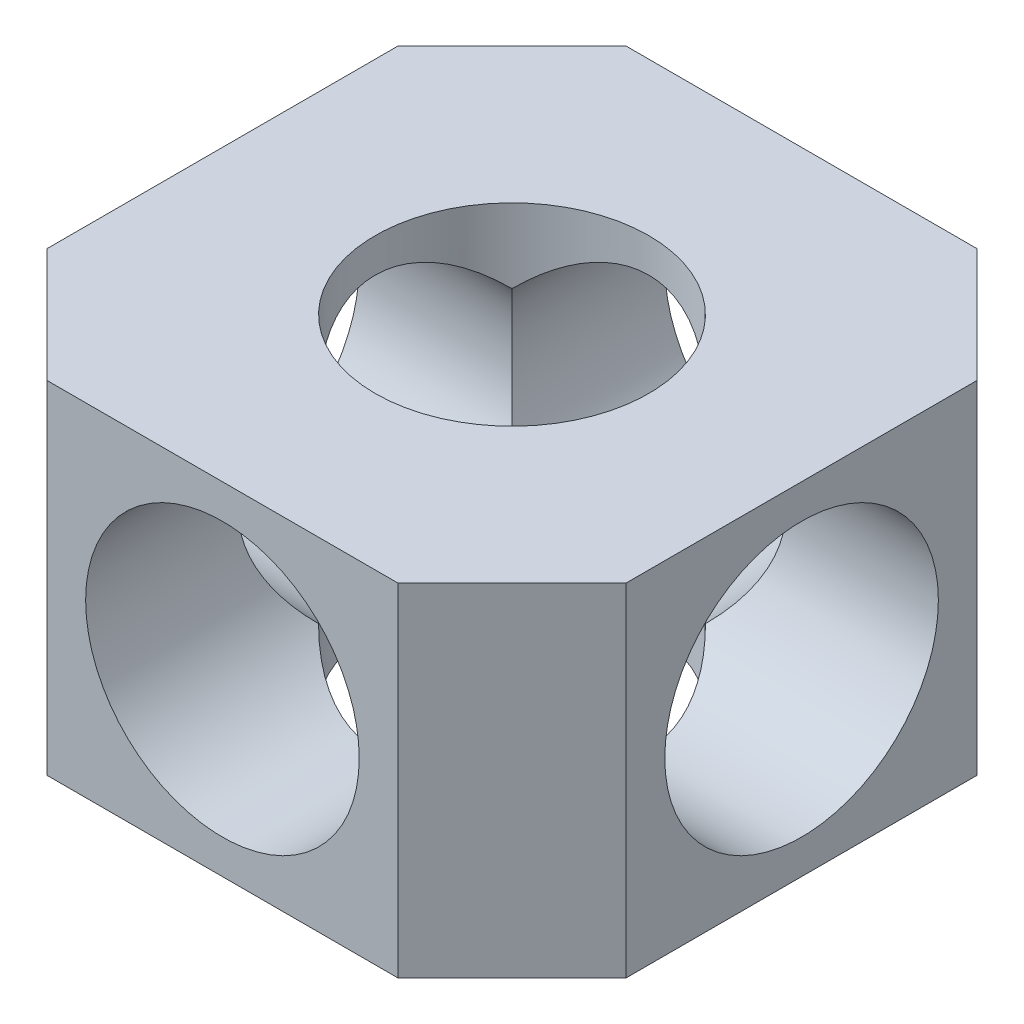
ISO-10303-21;
HEADER;
FILE_DESCRIPTION(('STEP AP214'),'2;1');
FILE_NAME('part.step','',(''),(''),'','','');
FILE_SCHEMA(('AUTOMOTIVE_DESIGN { 1 0 10303 214 1 1 1 1 }'));
ENDSEC;
DATA;
#1=APPLICATION_CONTEXT('core data for automotive mechanical design processes');
#2=APPLICATION_PROTOCOL_DEFINITION('international standard','automotive_design',2000,#1);
#3=PRODUCT_CONTEXT('',#1,'mechanical');
#4=PRODUCT('Part','Part','',(#3));
#5=PRODUCT_RELATED_PRODUCT_CATEGORY('part','',(#4));
#6=PRODUCT_DEFINITION_FORMATION('','',#4);
#7=PRODUCT_DEFINITION_CONTEXT('part definition',#1,'design');
#8=PRODUCT_DEFINITION('design','',#6,#7);
#9=PRODUCT_DEFINITION_SHAPE('','',#8);
#10=(LENGTH_UNIT() NAMED_UNIT(*) SI_UNIT(.MILLI.,.METRE.));
#11=(NAMED_UNIT(*) PLANE_ANGLE_UNIT() SI_UNIT($,.RADIAN.));
#12=(NAMED_UNIT(*) SI_UNIT($,.STERADIAN.) SOLID_ANGLE_UNIT());
#13=UNCERTAINTY_MEASURE_WITH_UNIT(LENGTH_MEASURE(1.E-05),#10,'distance_accuracy_value','');
#14=(GEOMETRIC_REPRESENTATION_CONTEXT(3) GLOBAL_UNCERTAINTY_ASSIGNED_CONTEXT((#13)) GLOBAL_UNIT_ASSIGNED_CONTEXT((#10,
#11,#12)) REPRESENTATION_CONTEXT('',''));
#15=CARTESIAN_POINT('',(0.,0.,0.));
#16=DIRECTION('',(0.,0.,1.));
#17=DIRECTION('',(1.,0.,0.));
#18=AXIS2_PLACEMENT_3D('',#15,#16,#17);
#19=CARTESIAN_POINT('',(0.,7.5,0.));
#20=DIRECTION('',(0.,1.,0.));
#21=DIRECTION('',(0.,0.,1.));
#22=AXIS2_PLACEMENT_3D('',#19,#20,#21);
#23=CYLINDRICAL_SURFACE('',#22,6.00000000000001);
#24=CARTESIAN_POINT('',(0.,7.5,0.));
#25=DIRECTION('',(0.,1.,0.));
#26=DIRECTION('',(0.,0.,1.));
#27=AXIS2_PLACEMENT_3D('',#24,#25,#26);
#28=CIRCLE('',#27,6.00000000000001);
#29=CARTESIAN_POINT('',(0.,7.5,6.00000000000001));
#30=VERTEX_POINT('',#29);
#31=EDGE_CURVE('E228',#30,#30,#28,.T.);
#32=ORIENTED_EDGE('',*,*,#31,.T.);
#33=EDGE_LOOP('',(#32));
#34=FACE_BOUND('',#33,.T.);
#35=CARTESIAN_POINT('',(0.,0.,0.));
#36=DIRECTION('',(0.,0.707106781186547,-0.707106781186547));
#37=DIRECTION('',(0.,0.707106781186547,0.707106781186547));
#38=AXIS2_PLACEMENT_3D('',#35,#36,#37);
#39=ELLIPSE('',#38,8.48528137423859,6.00000000000001);
#40=CARTESIAN_POINT('',(4.24264068711929,4.24264068711929,4.24264068711929));
#41=VERTEX_POINT('',#40);
#42=CARTESIAN_POINT('',(-4.24264068711929,4.24264068711929,4.24264068711929));
#43=VERTEX_POINT('',#42);
#44=EDGE_CURVE('E158',#41,#43,#39,.F.);
#45=ORIENTED_EDGE('',*,*,#44,.T.);
#46=CARTESIAN_POINT('',(0.,0.,0.));
#47=DIRECTION('',(0.707106781186547,0.707106781186547,0.));
#48=DIRECTION('',(-0.707106781186547,0.707106781186547,0.));
#49=AXIS2_PLACEMENT_3D('',#46,#47,#48);
#50=ELLIPSE('',#49,8.48528137423859,6.00000000000001);
#51=CARTESIAN_POINT('',(-4.24264068711929,4.24264068711929,-4.24264068711929));
#52=VERTEX_POINT('',#51);
#53=EDGE_CURVE('E151',#43,#52,#50,.F.);
#54=ORIENTED_EDGE('',*,*,#53,.T.);
#55=CARTESIAN_POINT('',(0.,0.,0.));
#56=DIRECTION('',(0.,0.707106781186547,0.707106781186547));
#57=DIRECTION('',(0.,0.707106781186547,-0.707106781186547));
#58=AXIS2_PLACEMENT_3D('',#55,#56,#57);
#59=ELLIPSE('',#58,8.48528137423859,6.00000000000001);
#60=CARTESIAN_POINT('',(4.24264068711929,4.24264068711929,-4.24264068711929));
#61=VERTEX_POINT('',#60);
#62=EDGE_CURVE('E142',#52,#61,#59,.F.);
#63=ORIENTED_EDGE('',*,*,#62,.T.);
#64=CARTESIAN_POINT('',(0.,0.,0.));
#65=DIRECTION('',(-0.707106781186547,0.707106781186547,0.));
#66=DIRECTION('',(0.707106781186547,0.707106781186547,0.));
#67=AXIS2_PLACEMENT_3D('',#64,#65,#66);
#68=ELLIPSE('',#67,8.48528137423859,6.00000000000001);
#69=EDGE_CURVE('E241',#61,#41,#68,.F.);
#70=ORIENTED_EDGE('',*,*,#69,.T.);
#71=EDGE_LOOP('',(#45,#54,#63,#70));
#72=FACE_BOUND('',#71,.T.);
#73=ADVANCED_FACE('F41',(#34,#72),#23,.F.);
#74=CARTESIAN_POINT('',(-12.7,7.5,-12.7));
#75=DIRECTION('',(1.,0.,0.));
#76=DIRECTION('',(0.,0.,-1.));
#77=AXIS2_PLACEMENT_3D('',#74,#75,#76);
#78=PLANE('',#77);
#79=CARTESIAN_POINT('',(-12.7,0.,0.));
#80=DIRECTION('',(1.,0.,0.));
#81=DIRECTION('',(0.,0.,-1.));
#82=AXIS2_PLACEMENT_3D('',#79,#80,#81);
#83=CIRCLE('',#82,6.00000000000001);
#84=CARTESIAN_POINT('',(-12.7,0.,-6.00000000000001));
#85=VERTEX_POINT('',#84);
#86=EDGE_CURVE('E155',#85,#85,#83,.T.);
#87=ORIENTED_EDGE('',*,*,#86,.T.);
#88=EDGE_LOOP('',(#87));
#89=FACE_BOUND('',#88,.T.);
#90=DIRECTION('',(0.,0.,1.));
#91=VECTOR('',#90,1.);
#92=CARTESIAN_POINT('',(-12.7,7.5,-12.7));
#93=LINE('',#92,#91);
#94=CARTESIAN_POINT('',(-12.7,7.5,-7.7));
#95=VERTEX_POINT('',#94);
#96=CARTESIAN_POINT('',(-12.7,7.5,7.69999999999999));
#97=VERTEX_POINT('',#96);
#98=EDGE_CURVE('E212',#95,#97,#93,.T.);
#99=ORIENTED_EDGE('',*,*,#98,.F.);
#100=DIRECTION('',(0.,-1.,0.));
#101=VECTOR('',#100,1.);
#102=CARTESIAN_POINT('',(-12.7,7.5,-7.7));
#103=LINE('',#102,#101);
#104=CARTESIAN_POINT('',(-12.7,-7.5,-7.7));
#105=VERTEX_POINT('',#104);
#106=EDGE_CURVE('E168',#95,#105,#103,.T.);
#107=ORIENTED_EDGE('',*,*,#106,.T.);
#108=DIRECTION('',(0.,0.,1.));
#109=VECTOR('',#108,1.);
#110=CARTESIAN_POINT('',(-12.7,-7.5,-12.7));
#111=LINE('',#110,#109);
#112=CARTESIAN_POINT('',(-12.7,-7.5,7.69999999999999));
#113=VERTEX_POINT('',#112);
#114=EDGE_CURVE('E214',#105,#113,#111,.T.);
#115=ORIENTED_EDGE('',*,*,#114,.T.);
#116=DIRECTION('',(0.,1.,0.));
#117=VECTOR('',#116,1.);
#118=CARTESIAN_POINT('',(-12.7,7.5,7.69999999999999));
#119=LINE('',#118,#117);
#120=EDGE_CURVE('E169',#113,#97,#119,.T.);
#121=ORIENTED_EDGE('',*,*,#120,.T.);
#122=EDGE_LOOP('',(#99,#107,#115,#121));
#123=FACE_BOUND('',#122,.T.);
#124=ADVANCED_FACE('F267',(#89,#123),#78,.F.);
#125=CARTESIAN_POINT('',(12.7,7.5,12.7));
#126=DIRECTION('',(0.,0.,-1.));
#127=DIRECTION('',(-1.,0.,0.));
#128=AXIS2_PLACEMENT_3D('',#125,#126,#127);
#129=PLANE('',#128);
#130=CARTESIAN_POINT('',(0.,0.,12.7));
#131=DIRECTION('',(0.,0.,1.));
#132=DIRECTION('',(1.,0.,0.));
#133=AXIS2_PLACEMENT_3D('',#130,#131,#132);
#134=CIRCLE('',#133,6.00000000000001);
#135=CARTESIAN_POINT('',(6.00000000000001,0.,12.7));
#136=VERTEX_POINT('',#135);
#137=EDGE_CURVE('E237',#136,#136,#134,.T.);
#138=ORIENTED_EDGE('',*,*,#137,.F.);
#139=EDGE_LOOP('',(#138));
#140=FACE_BOUND('',#139,.T.);
#141=DIRECTION('',(1.,0.,0.));
#142=VECTOR('',#141,1.);
#143=CARTESIAN_POINT('',(12.7,7.5,12.7));
#144=LINE('',#143,#142);
#145=CARTESIAN_POINT('',(-7.7,7.5,12.7));
#146=VERTEX_POINT('',#145);
#147=CARTESIAN_POINT('',(7.69999999999999,7.5,12.7));
#148=VERTEX_POINT('',#147);
#149=EDGE_CURVE('E221',#146,#148,#144,.T.);
#150=ORIENTED_EDGE('',*,*,#149,.F.);
#151=DIRECTION('',(0.,-1.,0.));
#152=VECTOR('',#151,1.);
#153=CARTESIAN_POINT('',(-7.7,7.5,12.7));
#154=LINE('',#153,#152);
#155=CARTESIAN_POINT('',(-7.7,-7.5,12.7));
#156=VERTEX_POINT('',#155);
#157=EDGE_CURVE('E192',#146,#156,#154,.T.);
#158=ORIENTED_EDGE('',*,*,#157,.T.);
#159=DIRECTION('',(1.,0.,0.));
#160=VECTOR('',#159,1.);
#161=CARTESIAN_POINT('',(12.7,-7.5,12.7));
#162=LINE('',#161,#160);
#163=CARTESIAN_POINT('',(7.69999999999999,-7.5,12.7));
#164=VERTEX_POINT('',#163);
#165=EDGE_CURVE('E211',#156,#164,#162,.T.);
#166=ORIENTED_EDGE('',*,*,#165,.T.);
#167=DIRECTION('',(0.,1.,0.));
#168=VECTOR('',#167,1.);
#169=CARTESIAN_POINT('',(7.69999999999999,7.5,12.7));
#170=LINE('',#169,#168);
#171=EDGE_CURVE('E191',#164,#148,#170,.T.);
#172=ORIENTED_EDGE('',*,*,#171,.T.);
#173=EDGE_LOOP('',(#150,#158,#166,#172));
#174=FACE_BOUND('',#173,.T.);
#175=ADVANCED_FACE('F257',(#140,#174),#129,.F.);
#176=CARTESIAN_POINT('',(12.7,7.5,-12.7));
#177=DIRECTION('',(-1.,0.,0.));
#178=DIRECTION('',(0.,0.,1.));
#179=AXIS2_PLACEMENT_3D('',#176,#177,#178);
#180=PLANE('',#179);
#181=CARTESIAN_POINT('',(12.7,0.,0.));
#182=DIRECTION('',(1.,0.,0.));
#183=DIRECTION('',(0.,0.,-1.));
#184=AXIS2_PLACEMENT_3D('',#181,#182,#183);
#185=CIRCLE('',#184,6.00000000000001);
#186=CARTESIAN_POINT('',(12.7,0.,-6.00000000000002));
#187=VERTEX_POINT('',#186);
#188=EDGE_CURVE('E253',#187,#187,#185,.T.);
#189=ORIENTED_EDGE('',*,*,#188,.F.);
#190=EDGE_LOOP('',(#189));
#191=FACE_BOUND('',#190,.T.);
#192=DIRECTION('',(0.,0.,-1.));
#193=VECTOR('',#192,1.);
#194=CARTESIAN_POINT('',(12.7,-7.5,-12.7));
#195=LINE('',#194,#193);
#196=CARTESIAN_POINT('',(12.7,-7.5,7.70000000000001));
#197=VERTEX_POINT('',#196);
#198=CARTESIAN_POINT('',(12.7,-7.5,-7.69999999999998));
#199=VERTEX_POINT('',#198);
#200=EDGE_CURVE('E203',#197,#199,#195,.T.);
#201=ORIENTED_EDGE('',*,*,#200,.T.);
#202=DIRECTION('',(0.,1.,0.));
#203=VECTOR('',#202,1.);
#204=CARTESIAN_POINT('',(12.7,7.5,-7.69999999999998));
#205=LINE('',#204,#203);
#206=CARTESIAN_POINT('',(12.7,7.5,-7.69999999999998));
#207=VERTEX_POINT('',#206);
#208=EDGE_CURVE('E11',#199,#207,#205,.T.);
#209=ORIENTED_EDGE('',*,*,#208,.T.);
#210=DIRECTION('',(0.,0.,-1.));
#211=VECTOR('',#210,1.);
#212=CARTESIAN_POINT('',(12.7,7.5,-12.7));
#213=LINE('',#212,#211);
#214=CARTESIAN_POINT('',(12.7,7.5,7.70000000000001));
#215=VERTEX_POINT('',#214);
#216=EDGE_CURVE('E205',#215,#207,#213,.T.);
#217=ORIENTED_EDGE('',*,*,#216,.F.);
#218=DIRECTION('',(0.,-1.,0.));
#219=VECTOR('',#218,1.);
#220=CARTESIAN_POINT('',(12.7,7.5,7.70000000000001));
#221=LINE('',#220,#219);
#222=EDGE_CURVE('E49',#215,#197,#221,.T.);
#223=ORIENTED_EDGE('',*,*,#222,.T.);
#224=EDGE_LOOP('',(#201,#209,#217,#223));
#225=FACE_BOUND('',#224,.T.);
#226=ADVANCED_FACE('F199',(#191,#225),#180,.F.);
#227=CARTESIAN_POINT('',(12.7,7.5,-12.7));
#228=DIRECTION('',(0.,0.,1.));
#229=DIRECTION('',(1.,0.,0.));
#230=AXIS2_PLACEMENT_3D('',#227,#228,#229);
#231=PLANE('',#230);
#232=CARTESIAN_POINT('',(0.,0.,-12.7));
#233=DIRECTION('',(0.,0.,1.));
#234=DIRECTION('',(1.,0.,0.));
#235=AXIS2_PLACEMENT_3D('',#232,#233,#234);
#236=CIRCLE('',#235,6.00000000000001);
#237=CARTESIAN_POINT('',(6.00000000000001,0.,-12.7));
#238=VERTEX_POINT('',#237);
#239=EDGE_CURVE('E231',#238,#238,#236,.T.);
#240=ORIENTED_EDGE('',*,*,#239,.T.);
#241=EDGE_LOOP('',(#240));
#242=FACE_BOUND('',#241,.T.);
#243=DIRECTION('',(-1.,0.,0.));
#244=VECTOR('',#243,1.);
#245=CARTESIAN_POINT('',(12.7,-7.5,-12.7));
#246=LINE('',#245,#244);
#247=CARTESIAN_POINT('',(7.7,-7.5,-12.7));
#248=VERTEX_POINT('',#247);
#249=CARTESIAN_POINT('',(-7.69999999999998,-7.5,-12.7));
#250=VERTEX_POINT('',#249);
#251=EDGE_CURVE('E209',#248,#250,#246,.T.);
#252=ORIENTED_EDGE('',*,*,#251,.T.);
#253=DIRECTION('',(0.,1.,0.));
#254=VECTOR('',#253,1.);
#255=CARTESIAN_POINT('',(-7.69999999999998,7.5,-12.7));
#256=LINE('',#255,#254);
#257=CARTESIAN_POINT('',(-7.69999999999998,7.5,-12.7));
#258=VERTEX_POINT('',#257);
#259=EDGE_CURVE('E184',#250,#258,#256,.T.);
#260=ORIENTED_EDGE('',*,*,#259,.T.);
#261=DIRECTION('',(-1.,0.,0.));
#262=VECTOR('',#261,1.);
#263=CARTESIAN_POINT('',(12.7,7.5,-12.7));
#264=LINE('',#263,#262);
#265=CARTESIAN_POINT('',(7.7,7.5,-12.7));
#266=VERTEX_POINT('',#265);
#267=EDGE_CURVE('E165',#266,#258,#264,.T.);
#268=ORIENTED_EDGE('',*,*,#267,.F.);
#269=DIRECTION('',(0.,-1.,0.));
#270=VECTOR('',#269,1.);
#271=CARTESIAN_POINT('',(7.7,7.5,-12.7));
#272=LINE('',#271,#270);
#273=EDGE_CURVE('E182',#266,#248,#272,.T.);
#274=ORIENTED_EDGE('',*,*,#273,.T.);
#275=EDGE_LOOP('',(#252,#260,#268,#274));
#276=FACE_BOUND('',#275,.T.);
#277=ADVANCED_FACE('F259',(#242,#276),#231,.F.);
#278=CARTESIAN_POINT('',(0.,7.5,0.));
#279=DIRECTION('',(0.,-1.,0.));
#280=DIRECTION('',(0.,0.,-1.));
#281=AXIS2_PLACEMENT_3D('',#278,#279,#280);
#282=PLANE('',#281);
#283=ORIENTED_EDGE('',*,*,#31,.F.);
#284=EDGE_LOOP('',(#283));
#285=FACE_BOUND('',#284,.T.);
#286=ORIENTED_EDGE('',*,*,#267,.T.);
#287=DIRECTION('',(0.707106781186549,0.,-0.707106781186546));
#288=VECTOR('',#287,1.);
#289=CARTESIAN_POINT('',(-12.7,7.5,-7.7));
#290=LINE('',#289,#288);
#291=EDGE_CURVE('E193',#258,#95,#290,.F.);
#292=ORIENTED_EDGE('',*,*,#291,.T.);
#293=ORIENTED_EDGE('',*,*,#98,.T.);
#294=DIRECTION('',(-0.707106781186546,0.,-0.707106781186549));
#295=VECTOR('',#294,1.);
#296=CARTESIAN_POINT('',(-7.7,7.5,12.7));
#297=LINE('',#296,#295);
#298=EDGE_CURVE('E186',#97,#146,#297,.F.);
#299=ORIENTED_EDGE('',*,*,#298,.T.);
#300=ORIENTED_EDGE('',*,*,#149,.T.);
#301=DIRECTION('',(-0.707106781186549,0.,0.707106781186546));
#302=VECTOR('',#301,1.);
#303=CARTESIAN_POINT('',(12.7,7.5,7.70000000000001));
#304=LINE('',#303,#302);
#305=EDGE_CURVE('E65',#148,#215,#304,.F.);
#306=ORIENTED_EDGE('',*,*,#305,.T.);
#307=ORIENTED_EDGE('',*,*,#216,.T.);
#308=DIRECTION('',(0.707106781186546,0.,0.707106781186549));
#309=VECTOR('',#308,1.);
#310=CARTESIAN_POINT('',(7.7,7.5,-12.7));
#311=LINE('',#310,#309);
#312=EDGE_CURVE('E190',#207,#266,#311,.F.);
#313=ORIENTED_EDGE('',*,*,#312,.T.);
#314=EDGE_LOOP('',(#286,#292,#293,#299,#300,#306,#307,#313));
#315=FACE_BOUND('',#314,.T.);
#316=ADVANCED_FACE('F266',(#285,#315),#282,.F.);
#317=CARTESIAN_POINT('',(0.,-7.5,0.));
#318=DIRECTION('',(0.,-1.,0.));
#319=DIRECTION('',(0.,0.,-1.));
#320=AXIS2_PLACEMENT_3D('',#317,#318,#319);
#321=PLANE('',#320);
#322=CARTESIAN_POINT('',(0.,-7.5,0.));
#323=DIRECTION('',(0.,1.,0.));
#324=DIRECTION('',(0.,0.,1.));
#325=AXIS2_PLACEMENT_3D('',#322,#323,#324);
#326=CIRCLE('',#325,6.00000000000001);
#327=CARTESIAN_POINT('',(0.,-7.5,6.00000000000001));
#328=VERTEX_POINT('',#327);
#329=EDGE_CURVE('E219',#328,#328,#326,.T.);
#330=ORIENTED_EDGE('',*,*,#329,.T.);
#331=EDGE_LOOP('',(#330));
#332=FACE_BOUND('',#331,.T.);
#333=ORIENTED_EDGE('',*,*,#114,.F.);
#334=DIRECTION('',(-0.707106781186549,0.,0.707106781186546));
#335=VECTOR('',#334,1.);
#336=CARTESIAN_POINT('',(-10.2,-7.5,-10.2));
#337=LINE('',#336,#335);
#338=EDGE_CURVE('E179',#105,#250,#337,.F.);
#339=ORIENTED_EDGE('',*,*,#338,.T.);
#340=ORIENTED_EDGE('',*,*,#251,.F.);
#341=DIRECTION('',(-0.707106781186546,0.,-0.707106781186549));
#342=VECTOR('',#341,1.);
#343=CARTESIAN_POINT('',(10.2,-7.5,-10.2));
#344=LINE('',#343,#342);
#345=EDGE_CURVE('E173',#248,#199,#344,.F.);
#346=ORIENTED_EDGE('',*,*,#345,.T.);
#347=ORIENTED_EDGE('',*,*,#200,.F.);
#348=DIRECTION('',(0.707106781186549,0.,-0.707106781186546));
#349=VECTOR('',#348,1.);
#350=CARTESIAN_POINT('',(10.2,-7.5,10.2));
#351=LINE('',#350,#349);
#352=EDGE_CURVE('E174',#197,#164,#351,.F.);
#353=ORIENTED_EDGE('',*,*,#352,.T.);
#354=ORIENTED_EDGE('',*,*,#165,.F.);
#355=DIRECTION('',(0.707106781186546,0.,0.707106781186549));
#356=VECTOR('',#355,1.);
#357=CARTESIAN_POINT('',(-10.2,-7.5,10.2));
#358=LINE('',#357,#356);
#359=EDGE_CURVE('E180',#156,#113,#358,.F.);
#360=ORIENTED_EDGE('',*,*,#359,.T.);
#361=EDGE_LOOP('',(#333,#339,#340,#346,#347,#353,#354,#360));
#362=FACE_BOUND('',#361,.T.);
#363=ADVANCED_FACE('F206',(#332,#362),#321,.T.);
#364=CARTESIAN_POINT('',(0.,0.,0.));
#365=DIRECTION('',(0.,0.707106781186547,0.707106781186547));
#366=DIRECTION('',(0.,0.707106781186547,-0.707106781186547));
#367=AXIS2_PLACEMENT_3D('',#364,#365,#366);
#368=ELLIPSE('',#367,8.48528137423859,6.00000000000001);
#369=CARTESIAN_POINT('',(-4.24264068711929,-4.24264068711929,4.24264068711929));
#370=VERTEX_POINT('',#369);
#371=CARTESIAN_POINT('',(4.24264068711929,-4.24264068711929,4.24264068711929));
#372=VERTEX_POINT('',#371);
#373=EDGE_CURVE('E160',#370,#372,#368,.T.);
#374=ORIENTED_EDGE('',*,*,#373,.T.);
#375=CARTESIAN_POINT('',(0.,0.,0.));
#376=DIRECTION('',(0.707106781186547,0.707106781186547,0.));
#377=DIRECTION('',(-0.707106781186547,0.707106781186547,0.));
#378=AXIS2_PLACEMENT_3D('',#375,#376,#377);
#379=ELLIPSE('',#378,8.48528137423859,6.00000000000001);
#380=CARTESIAN_POINT('',(4.24264068711929,-4.24264068711929,-4.24264068711929));
#381=VERTEX_POINT('',#380);
#382=EDGE_CURVE('E143',#372,#381,#379,.T.);
#383=ORIENTED_EDGE('',*,*,#382,.T.);
#384=CARTESIAN_POINT('',(0.,0.,0.));
#385=DIRECTION('',(0.,0.707106781186547,-0.707106781186547));
#386=DIRECTION('',(0.,0.707106781186547,0.707106781186547));
#387=AXIS2_PLACEMENT_3D('',#384,#385,#386);
#388=ELLIPSE('',#387,8.48528137423859,6.00000000000001);
#389=CARTESIAN_POINT('',(-4.24264068711929,-4.24264068711929,-4.24264068711929));
#390=VERTEX_POINT('',#389);
#391=EDGE_CURVE('E149',#381,#390,#388,.T.);
#392=ORIENTED_EDGE('',*,*,#391,.T.);
#393=CARTESIAN_POINT('',(0.,0.,0.));
#394=DIRECTION('',(-0.707106781186547,0.707106781186547,0.));
#395=DIRECTION('',(0.707106781186547,0.707106781186547,0.));
#396=AXIS2_PLACEMENT_3D('',#393,#394,#395);
#397=ELLIPSE('',#396,8.48528137423859,6.00000000000001);
#398=EDGE_CURVE('E128',#390,#370,#397,.T.);
#399=ORIENTED_EDGE('',*,*,#398,.T.);
#400=EDGE_LOOP('',(#374,#383,#392,#399));
#401=FACE_BOUND('',#400,.T.);
#402=ORIENTED_EDGE('',*,*,#329,.F.);
#403=EDGE_LOOP('',(#402));
#404=FACE_BOUND('',#403,.T.);
#405=ADVANCED_FACE('F154',(#401,#404),#23,.F.);
#406=CARTESIAN_POINT('',(0.,0.,12.7));
#407=DIRECTION('',(0.,0.,1.));
#408=DIRECTION('',(1.,0.,0.));
#409=AXIS2_PLACEMENT_3D('',#406,#407,#408);
#410=CYLINDRICAL_SURFACE('',#409,6.00000000000001);
#411=ORIENTED_EDGE('',*,*,#137,.T.);
#412=EDGE_LOOP('',(#411));
#413=FACE_BOUND('',#412,.T.);
#414=ORIENTED_EDGE('',*,*,#373,.F.);
#415=CARTESIAN_POINT('',(0.,0.,0.));
#416=DIRECTION('',(0.707106781186548,0.,0.707106781186547));
#417=DIRECTION('',(-0.707106781186547,0.,0.707106781186548));
#418=AXIS2_PLACEMENT_3D('',#415,#416,#417);
#419=ELLIPSE('',#418,8.48528137423859,6.00000000000001);
#420=EDGE_CURVE('E138',#370,#43,#419,.F.);
#421=ORIENTED_EDGE('',*,*,#420,.T.);
#422=ORIENTED_EDGE('',*,*,#44,.F.);
#423=CARTESIAN_POINT('',(0.,0.,0.));
#424=DIRECTION('',(-0.707106781186547,0.,0.707106781186548));
#425=DIRECTION('',(0.707106781186548,0.,0.707106781186547));
#426=AXIS2_PLACEMENT_3D('',#423,#424,#425);
#427=ELLIPSE('',#426,8.48528137423859,6.00000000000001);
#428=EDGE_CURVE('E242',#41,#372,#427,.F.);
#429=ORIENTED_EDGE('',*,*,#428,.T.);
#430=EDGE_LOOP('',(#414,#421,#422,#429));
#431=FACE_BOUND('',#430,.T.);
#432=ADVANCED_FACE('F281',(#413,#431),#410,.F.);
#433=ORIENTED_EDGE('',*,*,#239,.F.);
#434=EDGE_LOOP('',(#433));
#435=FACE_BOUND('',#434,.T.);
#436=ORIENTED_EDGE('',*,*,#391,.F.);
#437=CARTESIAN_POINT('',(0.,0.,0.));
#438=DIRECTION('',(0.707106781186548,0.,0.707106781186547));
#439=DIRECTION('',(-0.707106781186547,0.,0.707106781186548));
#440=AXIS2_PLACEMENT_3D('',#437,#438,#439);
#441=ELLIPSE('',#440,8.48528137423859,6.00000000000001);
#442=EDGE_CURVE('E239',#381,#61,#441,.T.);
#443=ORIENTED_EDGE('',*,*,#442,.T.);
#444=ORIENTED_EDGE('',*,*,#62,.F.);
#445=CARTESIAN_POINT('',(0.,0.,0.));
#446=DIRECTION('',(-0.707106781186547,0.,0.707106781186548));
#447=DIRECTION('',(0.707106781186548,0.,0.707106781186547));
#448=AXIS2_PLACEMENT_3D('',#445,#446,#447);
#449=ELLIPSE('',#448,8.48528137423859,6.00000000000001);
#450=EDGE_CURVE('E134',#52,#390,#449,.T.);
#451=ORIENTED_EDGE('',*,*,#450,.T.);
#452=EDGE_LOOP('',(#436,#443,#444,#451));
#453=FACE_BOUND('',#452,.T.);
#454=ADVANCED_FACE('F150',(#435,#453),#410,.F.);
#455=CARTESIAN_POINT('',(12.7,0.,0.));
#456=DIRECTION('',(1.,0.,0.));
#457=DIRECTION('',(0.,0.,-1.));
#458=AXIS2_PLACEMENT_3D('',#455,#456,#457);
#459=CYLINDRICAL_SURFACE('',#458,6.00000000000001);
#460=ORIENTED_EDGE('',*,*,#86,.F.);
#461=EDGE_LOOP('',(#460));
#462=FACE_BOUND('',#461,.T.);
#463=ORIENTED_EDGE('',*,*,#398,.F.);
#464=ORIENTED_EDGE('',*,*,#450,.F.);
#465=ORIENTED_EDGE('',*,*,#53,.F.);
#466=ORIENTED_EDGE('',*,*,#420,.F.);
#467=EDGE_LOOP('',(#463,#464,#465,#466));
#468=FACE_BOUND('',#467,.T.);
#469=ADVANCED_FACE('F135',(#462,#468),#459,.F.);
#470=ORIENTED_EDGE('',*,*,#188,.T.);
#471=EDGE_LOOP('',(#470));
#472=FACE_BOUND('',#471,.T.);
#473=ORIENTED_EDGE('',*,*,#382,.F.);
#474=ORIENTED_EDGE('',*,*,#428,.F.);
#475=ORIENTED_EDGE('',*,*,#69,.F.);
#476=ORIENTED_EDGE('',*,*,#442,.F.);
#477=EDGE_LOOP('',(#473,#474,#475,#476));
#478=FACE_BOUND('',#477,.T.);
#479=ADVANCED_FACE('F254',(#472,#478),#459,.F.);
#480=CARTESIAN_POINT('',(-12.7,7.5,-7.7));
#481=DIRECTION('',(0.707106781186546,0.,0.707106781186549));
#482=DIRECTION('',(0.,-1.,0.));
#483=AXIS2_PLACEMENT_3D('',#480,#481,#482);
#484=PLANE('',#483);
#485=ORIENTED_EDGE('',*,*,#291,.F.);
#486=ORIENTED_EDGE('',*,*,#259,.F.);
#487=ORIENTED_EDGE('',*,*,#338,.F.);
#488=ORIENTED_EDGE('',*,*,#106,.F.);
#489=EDGE_LOOP('',(#485,#486,#487,#488));
#490=FACE_BOUND('',#489,.T.);
#491=ADVANCED_FACE('F309',(#490),#484,.F.);
#492=CARTESIAN_POINT('',(-7.7,7.5,12.7));
#493=DIRECTION('',(0.707106781186549,0.,-0.707106781186546));
#494=DIRECTION('',(0.,-1.,0.));
#495=AXIS2_PLACEMENT_3D('',#492,#493,#494);
#496=PLANE('',#495);
#497=ORIENTED_EDGE('',*,*,#298,.F.);
#498=ORIENTED_EDGE('',*,*,#120,.F.);
#499=ORIENTED_EDGE('',*,*,#359,.F.);
#500=ORIENTED_EDGE('',*,*,#157,.F.);
#501=EDGE_LOOP('',(#497,#498,#499,#500));
#502=FACE_BOUND('',#501,.T.);
#503=ADVANCED_FACE('F316',(#502),#496,.F.);
#504=CARTESIAN_POINT('',(7.7,7.5,-12.7));
#505=DIRECTION('',(-0.707106781186549,0.,0.707106781186546));
#506=DIRECTION('',(0.,-1.,0.));
#507=AXIS2_PLACEMENT_3D('',#504,#505,#506);
#508=PLANE('',#507);
#509=ORIENTED_EDGE('',*,*,#312,.F.);
#510=ORIENTED_EDGE('',*,*,#208,.F.);
#511=ORIENTED_EDGE('',*,*,#345,.F.);
#512=ORIENTED_EDGE('',*,*,#273,.F.);
#513=EDGE_LOOP('',(#509,#510,#511,#512));
#514=FACE_BOUND('',#513,.T.);
#515=ADVANCED_FACE('F321',(#514),#508,.F.);
#516=CARTESIAN_POINT('',(12.7,7.5,7.70000000000001));
#517=DIRECTION('',(-0.707106781186546,0.,-0.707106781186549));
#518=DIRECTION('',(0.,-1.,0.));
#519=AXIS2_PLACEMENT_3D('',#516,#517,#518);
#520=PLANE('',#519);
#521=ORIENTED_EDGE('',*,*,#305,.F.);
#522=ORIENTED_EDGE('',*,*,#171,.F.);
#523=ORIENTED_EDGE('',*,*,#352,.F.);
#524=ORIENTED_EDGE('',*,*,#222,.F.);
#525=EDGE_LOOP('',(#521,#522,#523,#524));
#526=FACE_BOUND('',#525,.T.);
#527=ADVANCED_FACE('F42',(#526),#520,.F.);
#528=CLOSED_SHELL('',(#73,#124,#175,#226,#277,#316,#363,#405,#432,#454,#469,#479,#491,#503,#515,#527));
#529=MANIFOLD_SOLID_BREP('B2',#528);
#530=ADVANCED_BREP_SHAPE_REPRESENTATION('',(#18,#529),#14);
#531=SHAPE_DEFINITION_REPRESENTATION(#9,#530);
ENDSEC;
END-ISO-10303-21;
